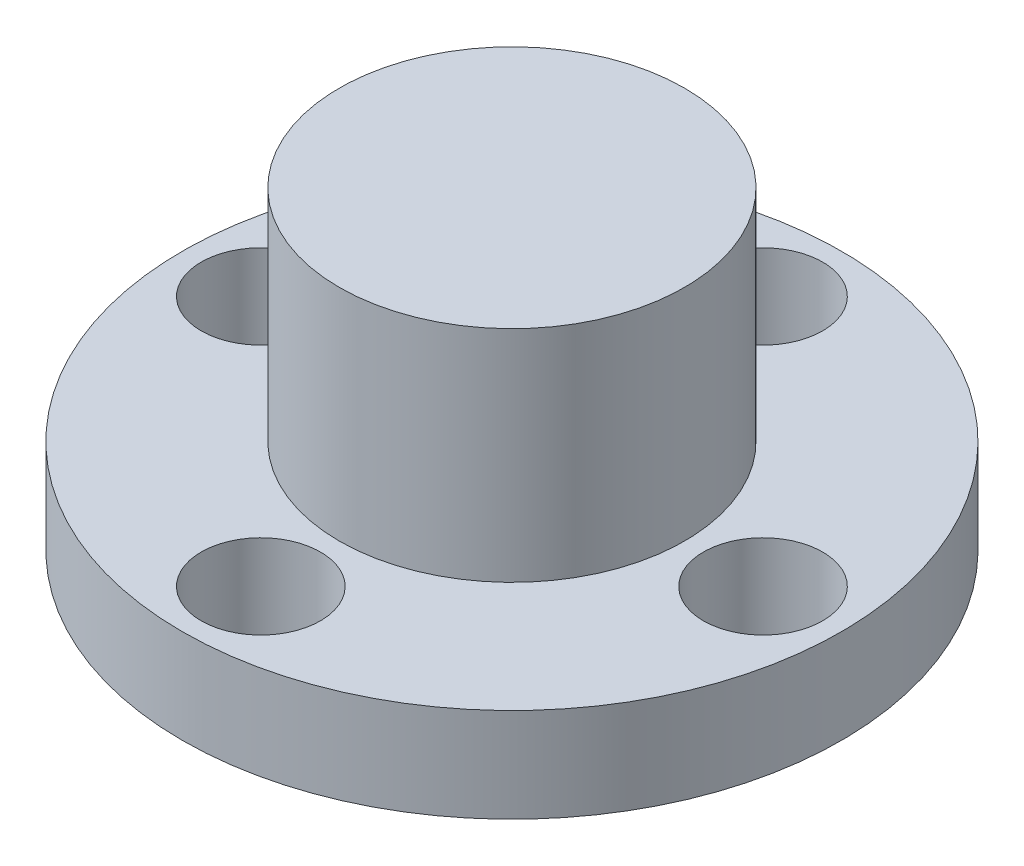
ISO-10303-21;
HEADER;
FILE_DESCRIPTION(('STEP AP214'),'2;1');
FILE_NAME('part.step','',(''),(''),'','','');
FILE_SCHEMA(('AUTOMOTIVE_DESIGN { 1 0 10303 214 1 1 1 1 }'));
ENDSEC;
DATA;
#1=APPLICATION_CONTEXT('core data for automotive mechanical design processes');
#2=APPLICATION_PROTOCOL_DEFINITION('international standard','automotive_design',2000,#1);
#3=PRODUCT_CONTEXT('',#1,'mechanical');
#4=PRODUCT('Part','Part','',(#3));
#5=PRODUCT_RELATED_PRODUCT_CATEGORY('part','',(#4));
#6=PRODUCT_DEFINITION_FORMATION('','',#4);
#7=PRODUCT_DEFINITION_CONTEXT('part definition',#1,'design');
#8=PRODUCT_DEFINITION('design','',#6,#7);
#9=PRODUCT_DEFINITION_SHAPE('','',#8);
#10=(LENGTH_UNIT() NAMED_UNIT(*) SI_UNIT(.MILLI.,.METRE.));
#11=(NAMED_UNIT(*) PLANE_ANGLE_UNIT() SI_UNIT($,.RADIAN.));
#12=(NAMED_UNIT(*) SI_UNIT($,.STERADIAN.) SOLID_ANGLE_UNIT());
#13=UNCERTAINTY_MEASURE_WITH_UNIT(LENGTH_MEASURE(1.E-05),#10,'distance_accuracy_value','');
#14=(GEOMETRIC_REPRESENTATION_CONTEXT(3) GLOBAL_UNCERTAINTY_ASSIGNED_CONTEXT((#13)) GLOBAL_UNIT_ASSIGNED_CONTEXT((#10,
#11,#12)) REPRESENTATION_CONTEXT('',''));
#15=CARTESIAN_POINT('',(0.,0.,0.));
#16=DIRECTION('',(0.,0.,1.));
#17=DIRECTION('',(1.,0.,0.));
#18=AXIS2_PLACEMENT_3D('',#15,#16,#17);
#19=CARTESIAN_POINT('',(8.,3.,0.));
#20=DIRECTION('',(0.,-1.,0.));
#21=DIRECTION('',(0.,0.,-1.));
#22=AXIS2_PLACEMENT_3D('',#19,#20,#21);
#23=CYLINDRICAL_SURFACE('',#22,1.9);
#24=CARTESIAN_POINT('',(8.,3.,0.));
#25=DIRECTION('',(0.,1.,0.));
#26=DIRECTION('',(0.,0.,1.));
#27=AXIS2_PLACEMENT_3D('',#24,#25,#26);
#28=CIRCLE('',#27,1.9);
#29=CARTESIAN_POINT('',(8.,3.,1.9));
#30=VERTEX_POINT('',#29);
#31=EDGE_CURVE('E53',#30,#30,#28,.T.);
#32=ORIENTED_EDGE('',*,*,#31,.T.);
#33=EDGE_LOOP('',(#32));
#34=FACE_BOUND('',#33,.T.);
#35=CARTESIAN_POINT('',(8.,0.,0.));
#36=DIRECTION('',(0.,1.,0.));
#37=DIRECTION('',(0.,0.,1.));
#38=AXIS2_PLACEMENT_3D('',#35,#36,#37);
#39=CIRCLE('',#38,1.9);
#40=CARTESIAN_POINT('',(8.,0.,1.9));
#41=VERTEX_POINT('',#40);
#42=EDGE_CURVE('E78',#41,#41,#39,.T.);
#43=ORIENTED_EDGE('',*,*,#42,.F.);
#44=EDGE_LOOP('',(#43));
#45=FACE_BOUND('',#44,.T.);
#46=ADVANCED_FACE('F44',(#34,#45),#23,.F.);
#47=CARTESIAN_POINT('',(0.,3.,8.));
#48=DIRECTION('',(0.,-1.,0.));
#49=DIRECTION('',(0.,0.,-1.));
#50=AXIS2_PLACEMENT_3D('',#47,#48,#49);
#51=CYLINDRICAL_SURFACE('',#50,1.9);
#52=CARTESIAN_POINT('',(0.,3.,8.));
#53=DIRECTION('',(0.,1.,0.));
#54=DIRECTION('',(0.,0.,1.));
#55=AXIS2_PLACEMENT_3D('',#52,#53,#54);
#56=CIRCLE('',#55,1.9);
#57=CARTESIAN_POINT('',(0.,3.,9.9));
#58=VERTEX_POINT('',#57);
#59=EDGE_CURVE('E58',#58,#58,#56,.T.);
#60=ORIENTED_EDGE('',*,*,#59,.T.);
#61=EDGE_LOOP('',(#60));
#62=FACE_BOUND('',#61,.T.);
#63=CARTESIAN_POINT('',(0.,0.,8.));
#64=DIRECTION('',(0.,1.,0.));
#65=DIRECTION('',(0.,0.,1.));
#66=AXIS2_PLACEMENT_3D('',#63,#64,#65);
#67=CIRCLE('',#66,1.9);
#68=CARTESIAN_POINT('',(0.,0.,9.9));
#69=VERTEX_POINT('',#68);
#70=EDGE_CURVE('E71',#69,#69,#67,.T.);
#71=ORIENTED_EDGE('',*,*,#70,.F.);
#72=EDGE_LOOP('',(#71));
#73=FACE_BOUND('',#72,.T.);
#74=ADVANCED_FACE('F101',(#62,#73),#51,.F.);
#75=CARTESIAN_POINT('',(-8.,3.,0.));
#76=DIRECTION('',(0.,-1.,0.));
#77=DIRECTION('',(0.,0.,-1.));
#78=AXIS2_PLACEMENT_3D('',#75,#76,#77);
#79=CYLINDRICAL_SURFACE('',#78,1.9);
#80=CARTESIAN_POINT('',(-8.,3.,0.));
#81=DIRECTION('',(0.,1.,0.));
#82=DIRECTION('',(0.,0.,1.));
#83=AXIS2_PLACEMENT_3D('',#80,#81,#82);
#84=CIRCLE('',#83,1.9);
#85=CARTESIAN_POINT('',(-8.,3.,1.89999999999994));
#86=VERTEX_POINT('',#85);
#87=EDGE_CURVE('E86',#86,#86,#84,.T.);
#88=ORIENTED_EDGE('',*,*,#87,.T.);
#89=EDGE_LOOP('',(#88));
#90=FACE_BOUND('',#89,.T.);
#91=CARTESIAN_POINT('',(-8.,0.,0.));
#92=DIRECTION('',(0.,1.,0.));
#93=DIRECTION('',(0.,0.,1.));
#94=AXIS2_PLACEMENT_3D('',#91,#92,#93);
#95=CIRCLE('',#94,1.9);
#96=CARTESIAN_POINT('',(-8.,0.,1.89999999999994));
#97=VERTEX_POINT('',#96);
#98=EDGE_CURVE('E67',#97,#97,#95,.T.);
#99=ORIENTED_EDGE('',*,*,#98,.F.);
#100=EDGE_LOOP('',(#99));
#101=FACE_BOUND('',#100,.T.);
#102=ADVANCED_FACE('F120',(#90,#101),#79,.F.);
#103=CARTESIAN_POINT('',(0.,3.,-8.));
#104=DIRECTION('',(0.,-1.,0.));
#105=DIRECTION('',(0.,0.,-1.));
#106=AXIS2_PLACEMENT_3D('',#103,#104,#105);
#107=CYLINDRICAL_SURFACE('',#106,1.9);
#108=CARTESIAN_POINT('',(0.,3.,-8.));
#109=DIRECTION('',(0.,1.,0.));
#110=DIRECTION('',(0.,0.,1.));
#111=AXIS2_PLACEMENT_3D('',#108,#109,#110);
#112=CIRCLE('',#111,1.9);
#113=CARTESIAN_POINT('',(0.,3.,-6.1));
#114=VERTEX_POINT('',#113);
#115=EDGE_CURVE('E82',#114,#114,#112,.T.);
#116=ORIENTED_EDGE('',*,*,#115,.T.);
#117=EDGE_LOOP('',(#116));
#118=FACE_BOUND('',#117,.T.);
#119=CARTESIAN_POINT('',(0.,0.,-8.));
#120=DIRECTION('',(0.,1.,0.));
#121=DIRECTION('',(0.,0.,1.));
#122=AXIS2_PLACEMENT_3D('',#119,#120,#121);
#123=CIRCLE('',#122,1.9);
#124=CARTESIAN_POINT('',(0.,0.,-6.1));
#125=VERTEX_POINT('',#124);
#126=EDGE_CURVE('E65',#125,#125,#123,.T.);
#127=ORIENTED_EDGE('',*,*,#126,.F.);
#128=EDGE_LOOP('',(#127));
#129=FACE_BOUND('',#128,.T.);
#130=ADVANCED_FACE('F50',(#118,#129),#107,.F.);
#131=CARTESIAN_POINT('',(0.,3.,0.));
#132=DIRECTION('',(0.,-1.,0.));
#133=DIRECTION('',(0.,0.,-1.));
#134=AXIS2_PLACEMENT_3D('',#131,#132,#133);
#135=CYLINDRICAL_SURFACE('',#134,10.5);
#136=CARTESIAN_POINT('',(0.,3.,0.));
#137=DIRECTION('',(0.,1.,0.));
#138=DIRECTION('',(0.,0.,1.));
#139=AXIS2_PLACEMENT_3D('',#136,#137,#138);
#140=CIRCLE('',#139,10.5);
#141=CARTESIAN_POINT('',(0.,3.,10.5));
#142=VERTEX_POINT('',#141);
#143=EDGE_CURVE('E10',#142,#142,#140,.T.);
#144=ORIENTED_EDGE('',*,*,#143,.F.);
#145=EDGE_LOOP('',(#144));
#146=FACE_BOUND('',#145,.T.);
#147=CARTESIAN_POINT('',(0.,0.,0.));
#148=DIRECTION('',(0.,1.,0.));
#149=DIRECTION('',(0.,0.,1.));
#150=AXIS2_PLACEMENT_3D('',#147,#148,#149);
#151=CIRCLE('',#150,10.5);
#152=CARTESIAN_POINT('',(0.,0.,10.5));
#153=VERTEX_POINT('',#152);
#154=EDGE_CURVE('E47',#153,#153,#151,.T.);
#155=ORIENTED_EDGE('',*,*,#154,.T.);
#156=EDGE_LOOP('',(#155));
#157=FACE_BOUND('',#156,.T.);
#158=ADVANCED_FACE('F107',(#146,#157),#135,.T.);
#159=CARTESIAN_POINT('',(0.,3.,0.));
#160=DIRECTION('',(0.,1.,0.));
#161=DIRECTION('',(0.,0.,1.));
#162=AXIS2_PLACEMENT_3D('',#159,#160,#161);
#163=PLANE('',#162);
#164=CARTESIAN_POINT('',(0.,3.,0.));
#165=DIRECTION('',(0.,1.,0.));
#166=DIRECTION('',(0.,0.,1.));
#167=AXIS2_PLACEMENT_3D('',#164,#165,#166);
#168=CIRCLE('',#167,5.5);
#169=CARTESIAN_POINT('',(0.,3.,5.5));
#170=VERTEX_POINT('',#169);
#171=EDGE_CURVE('E70',#170,#170,#168,.F.);
#172=ORIENTED_EDGE('',*,*,#171,.T.);
#173=EDGE_LOOP('',(#172));
#174=FACE_BOUND('',#173,.T.);
#175=ORIENTED_EDGE('',*,*,#115,.F.);
#176=EDGE_LOOP('',(#175));
#177=FACE_BOUND('',#176,.T.);
#178=ORIENTED_EDGE('',*,*,#87,.F.);
#179=EDGE_LOOP('',(#178));
#180=FACE_BOUND('',#179,.T.);
#181=ORIENTED_EDGE('',*,*,#59,.F.);
#182=EDGE_LOOP('',(#181));
#183=FACE_BOUND('',#182,.T.);
#184=ORIENTED_EDGE('',*,*,#31,.F.);
#185=EDGE_LOOP('',(#184));
#186=FACE_BOUND('',#185,.T.);
#187=ORIENTED_EDGE('',*,*,#143,.T.);
#188=EDGE_LOOP('',(#187));
#189=FACE_BOUND('',#188,.T.);
#190=ADVANCED_FACE('F102',(#174,#177,#180,#183,#186,#189),#163,.T.);
#191=CARTESIAN_POINT('',(0.,0.,0.));
#192=DIRECTION('',(0.,1.,0.));
#193=DIRECTION('',(0.,0.,1.));
#194=AXIS2_PLACEMENT_3D('',#191,#192,#193);
#195=PLANE('',#194);
#196=ORIENTED_EDGE('',*,*,#126,.T.);
#197=EDGE_LOOP('',(#196));
#198=FACE_BOUND('',#197,.T.);
#199=ORIENTED_EDGE('',*,*,#98,.T.);
#200=EDGE_LOOP('',(#199));
#201=FACE_BOUND('',#200,.T.);
#202=ORIENTED_EDGE('',*,*,#70,.T.);
#203=EDGE_LOOP('',(#202));
#204=FACE_BOUND('',#203,.T.);
#205=ORIENTED_EDGE('',*,*,#42,.T.);
#206=EDGE_LOOP('',(#205));
#207=FACE_BOUND('',#206,.T.);
#208=ORIENTED_EDGE('',*,*,#154,.F.);
#209=EDGE_LOOP('',(#208));
#210=FACE_BOUND('',#209,.T.);
#211=ADVANCED_FACE('F110',(#198,#201,#204,#207,#210),#195,.F.);
#212=CARTESIAN_POINT('',(0.,10.,0.));
#213=DIRECTION('',(0.,-1.,0.));
#214=DIRECTION('',(0.,0.,-1.));
#215=AXIS2_PLACEMENT_3D('',#212,#213,#214);
#216=CYLINDRICAL_SURFACE('',#215,5.5);
#217=ORIENTED_EDGE('',*,*,#171,.F.);
#218=EDGE_LOOP('',(#217));
#219=FACE_BOUND('',#218,.T.);
#220=CARTESIAN_POINT('',(0.,10.,0.));
#221=DIRECTION('',(0.,1.,0.));
#222=DIRECTION('',(0.,0.,1.));
#223=AXIS2_PLACEMENT_3D('',#220,#221,#222);
#224=CIRCLE('',#223,5.5);
#225=CARTESIAN_POINT('',(0.,10.,5.5));
#226=VERTEX_POINT('',#225);
#227=EDGE_CURVE('E151',#226,#226,#224,.T.);
#228=ORIENTED_EDGE('',*,*,#227,.F.);
#229=EDGE_LOOP('',(#228));
#230=FACE_BOUND('',#229,.T.);
#231=ADVANCED_FACE('F135',(#219,#230),#216,.T.);
#232=CARTESIAN_POINT('',(0.,10.,0.));
#233=DIRECTION('',(0.,1.,0.));
#234=DIRECTION('',(0.,0.,1.));
#235=AXIS2_PLACEMENT_3D('',#232,#233,#234);
#236=PLANE('',#235);
#237=ORIENTED_EDGE('',*,*,#227,.T.);
#238=EDGE_LOOP('',(#237));
#239=FACE_BOUND('',#238,.T.);
#240=ADVANCED_FACE('F143',(#239),#236,.T.);
#241=CLOSED_SHELL('',(#46,#74,#102,#130,#158,#190,#211,#231,#240));
#242=MANIFOLD_SOLID_BREP('B2',#241);
#243=ADVANCED_BREP_SHAPE_REPRESENTATION('',(#18,#242),#14);
#244=SHAPE_DEFINITION_REPRESENTATION(#9,#243);
ENDSEC;
END-ISO-10303-21;
